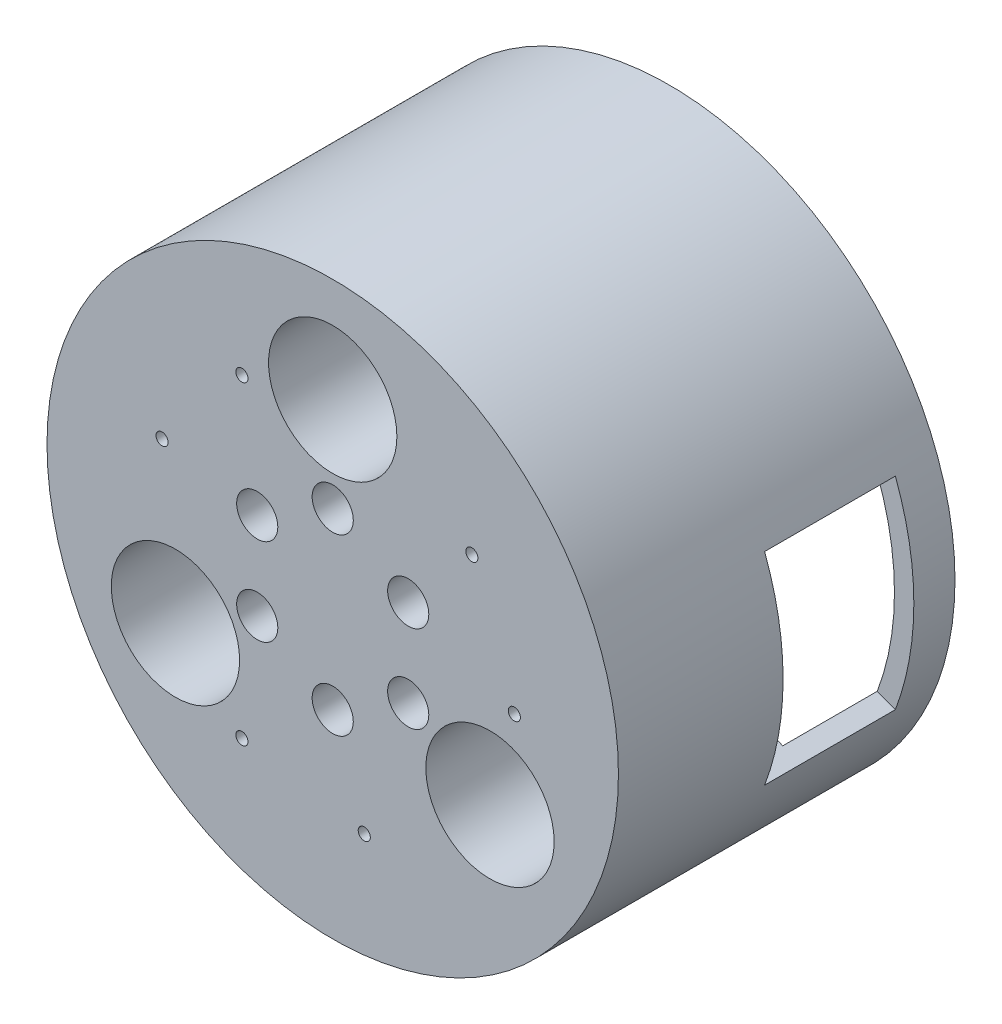
ISO-10303-21;
HEADER;
FILE_DESCRIPTION(('STEP AP214'),'2;1');
FILE_NAME('part.step','',(''),(''),'','','');
FILE_SCHEMA(('AUTOMOTIVE_DESIGN { 1 0 10303 214 1 1 1 1 }'));
ENDSEC;
DATA;
#1=APPLICATION_CONTEXT('core data for automotive mechanical design processes');
#2=APPLICATION_PROTOCOL_DEFINITION('international standard','automotive_design',2000,#1);
#3=PRODUCT_CONTEXT('',#1,'mechanical');
#4=PRODUCT('Part','Part','',(#3));
#5=PRODUCT_RELATED_PRODUCT_CATEGORY('part','',(#4));
#6=PRODUCT_DEFINITION_FORMATION('','',#4);
#7=PRODUCT_DEFINITION_CONTEXT('part definition',#1,'design');
#8=PRODUCT_DEFINITION('design','',#6,#7);
#9=PRODUCT_DEFINITION_SHAPE('','',#8);
#10=(LENGTH_UNIT() NAMED_UNIT(*) SI_UNIT(.MILLI.,.METRE.));
#11=(NAMED_UNIT(*) PLANE_ANGLE_UNIT() SI_UNIT($,.RADIAN.));
#12=(NAMED_UNIT(*) SI_UNIT($,.STERADIAN.) SOLID_ANGLE_UNIT());
#13=UNCERTAINTY_MEASURE_WITH_UNIT(LENGTH_MEASURE(1.E-05),#10,'distance_accuracy_value','');
#14=(GEOMETRIC_REPRESENTATION_CONTEXT(3) GLOBAL_UNCERTAINTY_ASSIGNED_CONTEXT((#13)) GLOBAL_UNIT_ASSIGNED_CONTEXT((#10,
#11,#12)) REPRESENTATION_CONTEXT('',''));
#15=CARTESIAN_POINT('',(0.,0.,0.));
#16=DIRECTION('',(0.,0.,1.));
#17=DIRECTION('',(1.,0.,0.));
#18=AXIS2_PLACEMENT_3D('',#15,#16,#17);
#19=CARTESIAN_POINT('',(0.,0.,28.));
#20=DIRECTION('',(0.,0.,-1.));
#21=DIRECTION('',(-1.,0.,0.));
#22=AXIS2_PLACEMENT_3D('',#19,#20,#21);
#23=CYLINDRICAL_SURFACE('',#22,55.);
#24=CARTESIAN_POINT('',(0.,0.,0.));
#25=DIRECTION('',(0.,0.,1.));
#26=DIRECTION('',(1.,0.,0.));
#27=AXIS2_PLACEMENT_3D('',#24,#25,#26);
#28=CIRCLE('',#27,55.);
#29=CARTESIAN_POINT('',(55.,0.,0.));
#30=VERTEX_POINT('',#29);
#31=EDGE_CURVE('E218',#30,#30,#28,.T.);
#32=ORIENTED_EDGE('',*,*,#31,.F.);
#33=EDGE_LOOP('',(#32));
#34=FACE_BOUND('',#33,.T.);
#35=CARTESIAN_POINT('',(0.,0.,8.5));
#36=DIRECTION('',(0.,0.,1.));
#37=DIRECTION('',(1.,0.,0.));
#38=AXIS2_PLACEMENT_3D('',#35,#36,#37);
#39=CIRCLE('',#38,55.);
#40=CARTESIAN_POINT('',(51.4388666792639,-19.4690265486726,8.5));
#41=VERTEX_POINT('',#40);
#42=CARTESIAN_POINT('',(51.4388666792639,19.4690265486726,8.5));
#43=VERTEX_POINT('',#42);
#44=EDGE_CURVE('E11',#41,#43,#39,.T.);
#45=ORIENTED_EDGE('',*,*,#44,.T.);
#46=DIRECTION('',(0.,0.,-1.));
#47=VECTOR('',#46,1.);
#48=CARTESIAN_POINT('',(51.4388666792639,19.4690265486726,28.));
#49=LINE('',#48,#47);
#50=CARTESIAN_POINT('',(51.4388666792639,19.4690265486726,28.));
#51=VERTEX_POINT('',#50);
#52=EDGE_CURVE('E139',#43,#51,#49,.F.);
#53=ORIENTED_EDGE('',*,*,#52,.T.);
#54=CARTESIAN_POINT('',(0.,0.,28.));
#55=DIRECTION('',(0.,0.,1.));
#56=DIRECTION('',(1.,0.,0.));
#57=AXIS2_PLACEMENT_3D('',#54,#55,#56);
#58=CIRCLE('',#57,55.);
#59=CARTESIAN_POINT('',(51.4388666792639,-19.4690265486726,28.));
#60=VERTEX_POINT('',#59);
#61=EDGE_CURVE('E221',#51,#60,#58,.T.);
#62=ORIENTED_EDGE('',*,*,#61,.T.);
#63=DIRECTION('',(0.,0.,-1.));
#64=VECTOR('',#63,1.);
#65=CARTESIAN_POINT('',(51.4388666792639,-19.4690265486726,28.));
#66=LINE('',#65,#64);
#67=EDGE_CURVE('E134',#60,#41,#66,.T.);
#68=ORIENTED_EDGE('',*,*,#67,.T.);
#69=EDGE_LOOP('',(#45,#53,#62,#68));
#70=FACE_BOUND('',#69,.T.);
#71=ADVANCED_FACE('F41',(#34,#70),#23,.F.);
#72=CARTESIAN_POINT('',(0.,0.,28.));
#73=DIRECTION('',(0.,0.,1.));
#74=DIRECTION('',(1.,0.,0.));
#75=AXIS2_PLACEMENT_3D('',#72,#73,#74);
#76=PLANE('',#75);
#77=DIRECTION('',(0.935252121441161,0.353982300884956,0.));
#78=VECTOR('',#77,1.);
#79=CARTESIAN_POINT('',(0.,0.,28.));
#80=LINE('',#79,#78);
#81=CARTESIAN_POINT('',(50.5036145578227,19.1150442477876,28.));
#82=VERTEX_POINT('',#81);
#83=EDGE_CURVE('E137',#82,#51,#80,.T.);
#84=ORIENTED_EDGE('',*,*,#83,.F.);
#85=CARTESIAN_POINT('',(0.,0.,28.));
#86=DIRECTION('',(0.,0.,1.));
#87=DIRECTION('',(1.,0.,0.));
#88=AXIS2_PLACEMENT_3D('',#85,#86,#87);
#89=CIRCLE('',#88,54.);
#90=CARTESIAN_POINT('',(50.5036145578227,-19.1150442477876,28.));
#91=VERTEX_POINT('',#90);
#92=EDGE_CURVE('E212',#82,#91,#89,.T.);
#93=ORIENTED_EDGE('',*,*,#92,.T.);
#94=DIRECTION('',(-0.935252121441161,0.353982300884956,0.));
#95=VECTOR('',#94,1.);
#96=CARTESIAN_POINT('',(0.,0.,28.));
#97=LINE('',#96,#95);
#98=EDGE_CURVE('E111',#60,#91,#97,.T.);
#99=ORIENTED_EDGE('',*,*,#98,.F.);
#100=ORIENTED_EDGE('',*,*,#61,.F.);
#101=EDGE_LOOP('',(#84,#93,#99,#100));
#102=FACE_BOUND('',#101,.T.);
#103=ADVANCED_FACE('F247',(#102),#76,.F.);
#104=CARTESIAN_POINT('',(0.,0.,40.));
#105=DIRECTION('',(0.,0.,-1.));
#106=DIRECTION('',(-1.,0.,0.));
#107=AXIS2_PLACEMENT_3D('',#104,#105,#106);
#108=CYLINDRICAL_SURFACE('',#107,54.);
#109=CARTESIAN_POINT('',(0.,0.,40.));
#110=DIRECTION('',(0.,0.,1.));
#111=DIRECTION('',(1.,0.,0.));
#112=AXIS2_PLACEMENT_3D('',#109,#110,#111);
#113=CIRCLE('',#112,54.);
#114=CARTESIAN_POINT('',(54.,0.,40.));
#115=VERTEX_POINT('',#114);
#116=EDGE_CURVE('E215',#115,#115,#113,.T.);
#117=ORIENTED_EDGE('',*,*,#116,.T.);
#118=EDGE_LOOP('',(#117));
#119=FACE_BOUND('',#118,.T.);
#120=ORIENTED_EDGE('',*,*,#92,.F.);
#121=DIRECTION('',(0.,0.,-1.));
#122=VECTOR('',#121,1.);
#123=CARTESIAN_POINT('',(50.5036145578227,19.1150442477876,35.5));
#124=LINE('',#123,#122);
#125=CARTESIAN_POINT('',(50.5036145578227,19.1150442477876,35.5));
#126=VERTEX_POINT('',#125);
#127=EDGE_CURVE('E112',#126,#82,#124,.T.);
#128=ORIENTED_EDGE('',*,*,#127,.F.);
#129=CARTESIAN_POINT('',(0.,0.,35.5));
#130=DIRECTION('',(0.,0.,-1.));
#131=DIRECTION('',(-1.,0.,0.));
#132=AXIS2_PLACEMENT_3D('',#129,#130,#131);
#133=CIRCLE('',#132,54.);
#134=CARTESIAN_POINT('',(50.5036145578227,-19.1150442477876,35.5));
#135=VERTEX_POINT('',#134);
#136=EDGE_CURVE('E99',#126,#135,#133,.T.);
#137=ORIENTED_EDGE('',*,*,#136,.T.);
#138=DIRECTION('',(0.,0.,-1.));
#139=VECTOR('',#138,1.);
#140=CARTESIAN_POINT('',(50.5036145578227,-19.1150442477876,35.5));
#141=LINE('',#140,#139);
#142=EDGE_CURVE('E129',#135,#91,#141,.T.);
#143=ORIENTED_EDGE('',*,*,#142,.T.);
#144=EDGE_LOOP('',(#120,#128,#137,#143));
#145=FACE_BOUND('',#144,.T.);
#146=ADVANCED_FACE('F253',(#119,#145),#108,.F.);
#147=CARTESIAN_POINT('',(0.,0.,69.5));
#148=DIRECTION('',(0.,0.,-1.));
#149=DIRECTION('',(-1.,0.,0.));
#150=AXIS2_PLACEMENT_3D('',#147,#148,#149);
#151=CYLINDRICAL_SURFACE('',#150,59.);
#152=DIRECTION('',(0.,0.,-1.));
#153=VECTOR('',#152,1.);
#154=CARTESIAN_POINT('',(55.1798751650285,-20.8849557522124,35.5));
#155=LINE('',#154,#153);
#156=CARTESIAN_POINT('',(55.1798751650285,-20.8849557522124,35.5));
#157=VERTEX_POINT('',#156);
#158=CARTESIAN_POINT('',(55.1798751650285,-20.8849557522124,8.5));
#159=VERTEX_POINT('',#158);
#160=EDGE_CURVE('E56',#157,#159,#155,.T.);
#161=ORIENTED_EDGE('',*,*,#160,.F.);
#162=CARTESIAN_POINT('',(0.,0.,35.5));
#163=DIRECTION('',(0.,0.,1.));
#164=DIRECTION('',(1.,0.,0.));
#165=AXIS2_PLACEMENT_3D('',#162,#163,#164);
#166=CIRCLE('',#165,59.);
#167=CARTESIAN_POINT('',(55.1798751650285,20.8849557522124,35.5));
#168=VERTEX_POINT('',#167);
#169=EDGE_CURVE('E97',#157,#168,#166,.T.);
#170=ORIENTED_EDGE('',*,*,#169,.T.);
#171=DIRECTION('',(0.,0.,-1.));
#172=VECTOR('',#171,1.);
#173=CARTESIAN_POINT('',(55.1798751650285,20.8849557522124,35.5));
#174=LINE('',#173,#172);
#175=CARTESIAN_POINT('',(55.1798751650285,20.8849557522124,8.5));
#176=VERTEX_POINT('',#175);
#177=EDGE_CURVE('E104',#168,#176,#174,.T.);
#178=ORIENTED_EDGE('',*,*,#177,.T.);
#179=CARTESIAN_POINT('',(0.,0.,8.5));
#180=DIRECTION('',(0.,0.,1.));
#181=DIRECTION('',(1.,0.,0.));
#182=AXIS2_PLACEMENT_3D('',#179,#180,#181);
#183=CIRCLE('',#182,59.);
#184=EDGE_CURVE('E124',#159,#176,#183,.T.);
#185=ORIENTED_EDGE('',*,*,#184,.F.);
#186=EDGE_LOOP('',(#161,#170,#178,#185));
#187=FACE_BOUND('',#186,.T.);
#188=CARTESIAN_POINT('',(0.,0.,69.5));
#189=DIRECTION('',(0.,0.,1.));
#190=DIRECTION('',(1.,0.,0.));
#191=AXIS2_PLACEMENT_3D('',#188,#189,#190);
#192=CIRCLE('',#191,59.);
#193=CARTESIAN_POINT('',(59.,0.,69.5));
#194=VERTEX_POINT('',#193);
#195=EDGE_CURVE('E49',#194,#194,#192,.T.);
#196=ORIENTED_EDGE('',*,*,#195,.F.);
#197=EDGE_LOOP('',(#196));
#198=FACE_BOUND('',#197,.T.);
#199=CARTESIAN_POINT('',(0.,0.,0.));
#200=DIRECTION('',(0.,0.,1.));
#201=DIRECTION('',(1.,0.,0.));
#202=AXIS2_PLACEMENT_3D('',#199,#200,#201);
#203=CIRCLE('',#202,59.);
#204=CARTESIAN_POINT('',(59.,0.,0.));
#205=VERTEX_POINT('',#204);
#206=EDGE_CURVE('E224',#205,#205,#203,.T.);
#207=ORIENTED_EDGE('',*,*,#206,.T.);
#208=EDGE_LOOP('',(#207));
#209=FACE_BOUND('',#208,.T.);
#210=ADVANCED_FACE('F43',(#187,#198,#209),#151,.T.);
#211=CARTESIAN_POINT('',(0.,0.,69.5));
#212=DIRECTION('',(0.,0.,1.));
#213=DIRECTION('',(1.,0.,0.));
#214=AXIS2_PLACEMENT_3D('',#211,#212,#213);
#215=PLANE('',#214);
#216=CARTESIAN_POINT('',(-35.2384732794716,12.8257553747126,69.5));
#217=DIRECTION('',(0.,0.,1.));
#218=DIRECTION('',(1.,0.,0.));
#219=AXIS2_PLACEMENT_3D('',#216,#217,#218);
#220=CIRCLE('',#219,1.25);
#221=CARTESIAN_POINT('',(-33.9884732794716,12.8257553747126,69.5));
#222=VERTEX_POINT('',#221);
#223=EDGE_CURVE('E426',#222,#222,#220,.T.);
#224=ORIENTED_EDGE('',*,*,#223,.F.);
#225=EDGE_LOOP('',(#224));
#226=FACE_BOUND('',#225,.T.);
#227=CARTESIAN_POINT('',(-18.75,-32.4759526419164,69.5));
#228=DIRECTION('',(0.,0.,1.));
#229=DIRECTION('',(1.,0.,0.));
#230=AXIS2_PLACEMENT_3D('',#227,#228,#229);
#231=CIRCLE('',#230,1.25);
#232=CARTESIAN_POINT('',(-17.5,-32.4759526419164,69.5));
#233=VERTEX_POINT('',#232);
#234=EDGE_CURVE('E432',#233,#233,#231,.T.);
#235=ORIENTED_EDGE('',*,*,#234,.F.);
#236=EDGE_LOOP('',(#235));
#237=FACE_BOUND('',#236,.T.);
#238=CARTESIAN_POINT('',(6.51180666250987,-36.9302907379578,69.5));
#239=DIRECTION('',(0.,0.,1.));
#240=DIRECTION('',(1.,0.,0.));
#241=AXIS2_PLACEMENT_3D('',#238,#239,#240);
#242=CIRCLE('',#241,1.25);
#243=CARTESIAN_POINT('',(7.76180666250987,-36.9302907379578,69.5));
#244=VERTEX_POINT('',#243);
#245=EDGE_CURVE('E416',#244,#244,#242,.T.);
#246=ORIENTED_EDGE('',*,*,#245,.F.);
#247=EDGE_LOOP('',(#246));
#248=FACE_BOUND('',#247,.T.);
#249=CARTESIAN_POINT('',(37.5,0.,69.5));
#250=DIRECTION('',(0.,0.,1.));
#251=DIRECTION('',(1.,0.,0.));
#252=AXIS2_PLACEMENT_3D('',#249,#250,#251);
#253=CIRCLE('',#252,1.25);
#254=CARTESIAN_POINT('',(38.75,0.,69.5));
#255=VERTEX_POINT('',#254);
#256=EDGE_CURVE('E411',#255,#255,#253,.T.);
#257=ORIENTED_EDGE('',*,*,#256,.F.);
#258=EDGE_LOOP('',(#257));
#259=FACE_BOUND('',#258,.T.);
#260=CARTESIAN_POINT('',(28.7266666169617,24.1045353632452,69.5));
#261=DIRECTION('',(0.,0.,1.));
#262=DIRECTION('',(1.,0.,0.));
#263=AXIS2_PLACEMENT_3D('',#260,#261,#262);
#264=CIRCLE('',#263,1.25);
#265=CARTESIAN_POINT('',(29.9766666169617,24.1045353632452,69.5));
#266=VERTEX_POINT('',#265);
#267=EDGE_CURVE('E418',#266,#266,#264,.T.);
#268=ORIENTED_EDGE('',*,*,#267,.F.);
#269=EDGE_LOOP('',(#268));
#270=FACE_BOUND('',#269,.T.);
#271=CARTESIAN_POINT('',(-18.75,32.4759526419165,69.5));
#272=DIRECTION('',(0.,0.,1.));
#273=DIRECTION('',(1.,0.,0.));
#274=AXIS2_PLACEMENT_3D('',#271,#272,#273);
#275=CIRCLE('',#274,1.25);
#276=CARTESIAN_POINT('',(-17.5,32.4759526419165,69.5));
#277=VERTEX_POINT('',#276);
#278=EDGE_CURVE('E119',#277,#277,#275,.T.);
#279=ORIENTED_EDGE('',*,*,#278,.F.);
#280=EDGE_LOOP('',(#279));
#281=FACE_BOUND('',#280,.T.);
#282=CARTESIAN_POINT('',(0.,37.5,69.5));
#283=DIRECTION('',(0.,0.,1.));
#284=DIRECTION('',(1.,0.,0.));
#285=AXIS2_PLACEMENT_3D('',#282,#283,#284);
#286=CIRCLE('',#285,13.25);
#287=CARTESIAN_POINT('',(13.25,37.5,69.5));
#288=VERTEX_POINT('',#287);
#289=EDGE_CURVE('E165',#288,#288,#286,.T.);
#290=ORIENTED_EDGE('',*,*,#289,.F.);
#291=EDGE_LOOP('',(#290));
#292=FACE_BOUND('',#291,.T.);
#293=CARTESIAN_POINT('',(-32.4759526419165,-18.75,69.5));
#294=DIRECTION('',(0.,0.,1.));
#295=DIRECTION('',(1.,0.,0.));
#296=AXIS2_PLACEMENT_3D('',#293,#294,#295);
#297=CIRCLE('',#296,13.25);
#298=CARTESIAN_POINT('',(-19.2259526419165,-18.75,69.5));
#299=VERTEX_POINT('',#298);
#300=EDGE_CURVE('E168',#299,#299,#297,.T.);
#301=ORIENTED_EDGE('',*,*,#300,.F.);
#302=EDGE_LOOP('',(#301));
#303=FACE_BOUND('',#302,.T.);
#304=CARTESIAN_POINT('',(32.4759526419164,-18.75,69.5));
#305=DIRECTION('',(0.,0.,1.));
#306=DIRECTION('',(1.,0.,0.));
#307=AXIS2_PLACEMENT_3D('',#304,#305,#306);
#308=CIRCLE('',#307,13.25);
#309=CARTESIAN_POINT('',(45.7259526419164,-18.75,69.5));
#310=VERTEX_POINT('',#309);
#311=EDGE_CURVE('E174',#310,#310,#308,.T.);
#312=ORIENTED_EDGE('',*,*,#311,.F.);
#313=EDGE_LOOP('',(#312));
#314=FACE_BOUND('',#313,.T.);
#315=CARTESIAN_POINT('',(15.5884572681199,-8.99999999999999,69.5));
#316=DIRECTION('',(0.,0.,1.));
#317=DIRECTION('',(1.,0.,0.));
#318=AXIS2_PLACEMENT_3D('',#315,#316,#317);
#319=CIRCLE('',#318,4.25);
#320=CARTESIAN_POINT('',(19.8384572681199,-8.99999999999999,69.5));
#321=VERTEX_POINT('',#320);
#322=EDGE_CURVE('E204',#321,#321,#319,.T.);
#323=ORIENTED_EDGE('',*,*,#322,.F.);
#324=EDGE_LOOP('',(#323));
#325=FACE_BOUND('',#324,.T.);
#326=CARTESIAN_POINT('',(0.,-18.,69.5));
#327=DIRECTION('',(0.,0.,1.));
#328=DIRECTION('',(1.,0.,0.));
#329=AXIS2_PLACEMENT_3D('',#326,#327,#328);
#330=CIRCLE('',#329,4.25);
#331=CARTESIAN_POINT('',(4.25,-18.,69.5));
#332=VERTEX_POINT('',#331);
#333=EDGE_CURVE('E198',#332,#332,#330,.T.);
#334=ORIENTED_EDGE('',*,*,#333,.F.);
#335=EDGE_LOOP('',(#334));
#336=FACE_BOUND('',#335,.T.);
#337=CARTESIAN_POINT('',(-15.5884572681199,-8.99999999999999,69.5));
#338=DIRECTION('',(0.,0.,1.));
#339=DIRECTION('',(1.,0.,0.));
#340=AXIS2_PLACEMENT_3D('',#337,#338,#339);
#341=CIRCLE('',#340,4.25);
#342=CARTESIAN_POINT('',(-11.3384572681199,-8.99999999999999,69.5));
#343=VERTEX_POINT('',#342);
#344=EDGE_CURVE('E192',#343,#343,#341,.T.);
#345=ORIENTED_EDGE('',*,*,#344,.F.);
#346=EDGE_LOOP('',(#345));
#347=FACE_BOUND('',#346,.T.);
#348=CARTESIAN_POINT('',(-15.5884572681199,9.00000000000001,69.5));
#349=DIRECTION('',(0.,0.,1.));
#350=DIRECTION('',(1.,0.,0.));
#351=AXIS2_PLACEMENT_3D('',#348,#349,#350);
#352=CIRCLE('',#351,4.25);
#353=CARTESIAN_POINT('',(-11.3384572681199,9.00000000000001,69.5));
#354=VERTEX_POINT('',#353);
#355=EDGE_CURVE('E186',#354,#354,#352,.T.);
#356=ORIENTED_EDGE('',*,*,#355,.F.);
#357=EDGE_LOOP('',(#356));
#358=FACE_BOUND('',#357,.T.);
#359=CARTESIAN_POINT('',(0.,18.,69.5));
#360=DIRECTION('',(0.,0.,1.));
#361=DIRECTION('',(1.,0.,0.));
#362=AXIS2_PLACEMENT_3D('',#359,#360,#361);
#363=CIRCLE('',#362,4.25);
#364=CARTESIAN_POINT('',(4.25,18.,69.5));
#365=VERTEX_POINT('',#364);
#366=EDGE_CURVE('E179',#365,#365,#363,.T.);
#367=ORIENTED_EDGE('',*,*,#366,.F.);
#368=EDGE_LOOP('',(#367));
#369=FACE_BOUND('',#368,.T.);
#370=CARTESIAN_POINT('',(15.5884572681199,9.,69.5));
#371=DIRECTION('',(0.,0.,1.));
#372=DIRECTION('',(1.,0.,0.));
#373=AXIS2_PLACEMENT_3D('',#370,#371,#372);
#374=CIRCLE('',#373,4.25);
#375=CARTESIAN_POINT('',(19.8384572681199,9.,69.5));
#376=VERTEX_POINT('',#375);
#377=EDGE_CURVE('E182',#376,#376,#374,.T.);
#378=ORIENTED_EDGE('',*,*,#377,.F.);
#379=EDGE_LOOP('',(#378));
#380=FACE_BOUND('',#379,.T.);
#381=ORIENTED_EDGE('',*,*,#195,.T.);
#382=EDGE_LOOP('',(#381));
#383=FACE_BOUND('',#382,.T.);
#384=ADVANCED_FACE('F235',(#226,#237,#248,#259,#270,#281,#292,#303,#314,#325,#336,#347,#358,
#369,#380,#383),#215,.T.);
#385=CARTESIAN_POINT('',(0.,0.,0.));
#386=DIRECTION('',(0.,0.,1.));
#387=DIRECTION('',(1.,0.,0.));
#388=AXIS2_PLACEMENT_3D('',#385,#386,#387);
#389=PLANE('',#388);
#390=ORIENTED_EDGE('',*,*,#31,.T.);
#391=EDGE_LOOP('',(#390));
#392=FACE_BOUND('',#391,.T.);
#393=ORIENTED_EDGE('',*,*,#206,.F.);
#394=EDGE_LOOP('',(#393));
#395=FACE_BOUND('',#394,.T.);
#396=ADVANCED_FACE('F232',(#392,#395),#389,.F.);
#397=CARTESIAN_POINT('',(0.,0.,40.));
#398=DIRECTION('',(0.,0.,1.));
#399=DIRECTION('',(1.,0.,0.));
#400=AXIS2_PLACEMENT_3D('',#397,#398,#399);
#401=PLANE('',#400);
#402=CARTESIAN_POINT('',(0.,37.5,40.));
#403=DIRECTION('',(0.,0.,1.));
#404=DIRECTION('',(1.,0.,0.));
#405=AXIS2_PLACEMENT_3D('',#402,#403,#404);
#406=CIRCLE('',#405,9.);
#407=CARTESIAN_POINT('',(9.,37.5,40.));
#408=VERTEX_POINT('',#407);
#409=EDGE_CURVE('E143',#408,#408,#406,.T.);
#410=ORIENTED_EDGE('',*,*,#409,.T.);
#411=EDGE_LOOP('',(#410));
#412=FACE_BOUND('',#411,.T.);
#413=CARTESIAN_POINT('',(-32.4759526419165,-18.75,40.));
#414=DIRECTION('',(0.,0.,1.));
#415=DIRECTION('',(1.,0.,0.));
#416=AXIS2_PLACEMENT_3D('',#413,#414,#415);
#417=CIRCLE('',#416,9.);
#418=CARTESIAN_POINT('',(-23.4759526419165,-18.75,40.));
#419=VERTEX_POINT('',#418);
#420=EDGE_CURVE('E153',#419,#419,#417,.T.);
#421=ORIENTED_EDGE('',*,*,#420,.T.);
#422=EDGE_LOOP('',(#421));
#423=FACE_BOUND('',#422,.T.);
#424=CARTESIAN_POINT('',(32.4759526419164,-18.75,40.));
#425=DIRECTION('',(0.,0.,1.));
#426=DIRECTION('',(1.,0.,0.));
#427=AXIS2_PLACEMENT_3D('',#424,#425,#426);
#428=CIRCLE('',#427,9.);
#429=CARTESIAN_POINT('',(41.4759526419164,-18.75,40.));
#430=VERTEX_POINT('',#429);
#431=EDGE_CURVE('E142',#430,#430,#428,.T.);
#432=ORIENTED_EDGE('',*,*,#431,.T.);
#433=EDGE_LOOP('',(#432));
#434=FACE_BOUND('',#433,.T.);
#435=ORIENTED_EDGE('',*,*,#116,.F.);
#436=EDGE_LOOP('',(#435));
#437=FACE_BOUND('',#436,.T.);
#438=ADVANCED_FACE('F234',(#412,#423,#434,#437),#401,.F.);
#439=CARTESIAN_POINT('',(15.5884572681199,9.,45.5));
#440=DIRECTION('',(0.,0.,1.));
#441=DIRECTION('',(1.,0.,0.));
#442=AXIS2_PLACEMENT_3D('',#439,#440,#441);
#443=CYLINDRICAL_SURFACE('',#442,4.25);
#444=CARTESIAN_POINT('',(15.5884572681199,9.,45.5));
#445=DIRECTION('',(0.,0.,1.));
#446=DIRECTION('',(1.,0.,0.));
#447=AXIS2_PLACEMENT_3D('',#444,#445,#446);
#448=CIRCLE('',#447,4.25);
#449=CARTESIAN_POINT('',(19.8384572681199,9.,45.5));
#450=VERTEX_POINT('',#449);
#451=EDGE_CURVE('E209',#450,#450,#448,.T.);
#452=ORIENTED_EDGE('',*,*,#451,.F.);
#453=EDGE_LOOP('',(#452));
#454=FACE_BOUND('',#453,.T.);
#455=ORIENTED_EDGE('',*,*,#377,.T.);
#456=EDGE_LOOP('',(#455));
#457=FACE_BOUND('',#456,.T.);
#458=ADVANCED_FACE('F241',(#454,#457),#443,.F.);
#459=CARTESIAN_POINT('',(15.5884572681199,9.,45.5));
#460=DIRECTION('',(0.,0.,1.));
#461=DIRECTION('',(1.,0.,0.));
#462=AXIS2_PLACEMENT_3D('',#459,#460,#461);
#463=PLANE('',#462);
#464=ORIENTED_EDGE('',*,*,#451,.T.);
#465=EDGE_LOOP('',(#464));
#466=FACE_BOUND('',#465,.T.);
#467=ADVANCED_FACE('F264',(#466),#463,.T.);
#468=CARTESIAN_POINT('',(0.,18.,45.5));
#469=DIRECTION('',(0.,0.,1.));
#470=DIRECTION('',(1.,0.,0.));
#471=AXIS2_PLACEMENT_3D('',#468,#469,#470);
#472=CYLINDRICAL_SURFACE('',#471,4.25);
#473=CARTESIAN_POINT('',(0.,18.,45.5));
#474=DIRECTION('',(0.,0.,1.));
#475=DIRECTION('',(1.,0.,0.));
#476=AXIS2_PLACEMENT_3D('',#473,#474,#475);
#477=CIRCLE('',#476,4.25);
#478=CARTESIAN_POINT('',(4.25,18.,45.5));
#479=VERTEX_POINT('',#478);
#480=EDGE_CURVE('E183',#479,#479,#477,.T.);
#481=ORIENTED_EDGE('',*,*,#480,.F.);
#482=EDGE_LOOP('',(#481));
#483=FACE_BOUND('',#482,.T.);
#484=ORIENTED_EDGE('',*,*,#366,.T.);
#485=EDGE_LOOP('',(#484));
#486=FACE_BOUND('',#485,.T.);
#487=ADVANCED_FACE('F268',(#483,#486),#472,.F.);
#488=CARTESIAN_POINT('',(0.,18.,45.5));
#489=DIRECTION('',(0.,0.,1.));
#490=DIRECTION('',(1.,0.,0.));
#491=AXIS2_PLACEMENT_3D('',#488,#489,#490);
#492=PLANE('',#491);
#493=ORIENTED_EDGE('',*,*,#480,.T.);
#494=EDGE_LOOP('',(#493));
#495=FACE_BOUND('',#494,.T.);
#496=ADVANCED_FACE('F302',(#495),#492,.T.);
#497=CARTESIAN_POINT('',(-15.5884572681199,9.00000000000001,45.5));
#498=DIRECTION('',(0.,0.,1.));
#499=DIRECTION('',(1.,0.,0.));
#500=AXIS2_PLACEMENT_3D('',#497,#498,#499);
#501=CYLINDRICAL_SURFACE('',#500,4.25);
#502=CARTESIAN_POINT('',(-15.5884572681199,9.00000000000001,45.5));
#503=DIRECTION('',(0.,0.,1.));
#504=DIRECTION('',(1.,0.,0.));
#505=AXIS2_PLACEMENT_3D('',#502,#503,#504);
#506=CIRCLE('',#505,4.25);
#507=CARTESIAN_POINT('',(-11.3384572681199,9.00000000000001,45.5));
#508=VERTEX_POINT('',#507);
#509=EDGE_CURVE('E189',#508,#508,#506,.T.);
#510=ORIENTED_EDGE('',*,*,#509,.F.);
#511=EDGE_LOOP('',(#510));
#512=FACE_BOUND('',#511,.T.);
#513=ORIENTED_EDGE('',*,*,#355,.T.);
#514=EDGE_LOOP('',(#513));
#515=FACE_BOUND('',#514,.T.);
#516=ADVANCED_FACE('F298',(#512,#515),#501,.F.);
#517=CARTESIAN_POINT('',(-15.5884572681199,9.00000000000001,45.5));
#518=DIRECTION('',(0.,0.,1.));
#519=DIRECTION('',(1.,0.,0.));
#520=AXIS2_PLACEMENT_3D('',#517,#518,#519);
#521=PLANE('',#520);
#522=ORIENTED_EDGE('',*,*,#509,.T.);
#523=EDGE_LOOP('',(#522));
#524=FACE_BOUND('',#523,.T.);
#525=ADVANCED_FACE('F294',(#524),#521,.T.);
#526=CARTESIAN_POINT('',(-15.5884572681199,-8.99999999999999,45.5));
#527=DIRECTION('',(0.,0.,1.));
#528=DIRECTION('',(1.,0.,0.));
#529=AXIS2_PLACEMENT_3D('',#526,#527,#528);
#530=CYLINDRICAL_SURFACE('',#529,4.25);
#531=CARTESIAN_POINT('',(-15.5884572681199,-8.99999999999999,45.5));
#532=DIRECTION('',(0.,0.,1.));
#533=DIRECTION('',(1.,0.,0.));
#534=AXIS2_PLACEMENT_3D('',#531,#532,#533);
#535=CIRCLE('',#534,4.25);
#536=CARTESIAN_POINT('',(-11.3384572681199,-8.99999999999999,45.5));
#537=VERTEX_POINT('',#536);
#538=EDGE_CURVE('E195',#537,#537,#535,.T.);
#539=ORIENTED_EDGE('',*,*,#538,.F.);
#540=EDGE_LOOP('',(#539));
#541=FACE_BOUND('',#540,.T.);
#542=ORIENTED_EDGE('',*,*,#344,.T.);
#543=EDGE_LOOP('',(#542));
#544=FACE_BOUND('',#543,.T.);
#545=ADVANCED_FACE('F290',(#541,#544),#530,.F.);
#546=CARTESIAN_POINT('',(-15.5884572681199,-8.99999999999999,45.5));
#547=DIRECTION('',(0.,0.,1.));
#548=DIRECTION('',(1.,0.,0.));
#549=AXIS2_PLACEMENT_3D('',#546,#547,#548);
#550=PLANE('',#549);
#551=ORIENTED_EDGE('',*,*,#538,.T.);
#552=EDGE_LOOP('',(#551));
#553=FACE_BOUND('',#552,.T.);
#554=ADVANCED_FACE('F286',(#553),#550,.T.);
#555=CARTESIAN_POINT('',(0.,-18.,45.5));
#556=DIRECTION('',(0.,0.,1.));
#557=DIRECTION('',(1.,0.,0.));
#558=AXIS2_PLACEMENT_3D('',#555,#556,#557);
#559=CYLINDRICAL_SURFACE('',#558,4.25);
#560=CARTESIAN_POINT('',(0.,-18.,45.5));
#561=DIRECTION('',(0.,0.,1.));
#562=DIRECTION('',(1.,0.,0.));
#563=AXIS2_PLACEMENT_3D('',#560,#561,#562);
#564=CIRCLE('',#563,4.25);
#565=CARTESIAN_POINT('',(4.25,-18.,45.5));
#566=VERTEX_POINT('',#565);
#567=EDGE_CURVE('E201',#566,#566,#564,.T.);
#568=ORIENTED_EDGE('',*,*,#567,.F.);
#569=EDGE_LOOP('',(#568));
#570=FACE_BOUND('',#569,.T.);
#571=ORIENTED_EDGE('',*,*,#333,.T.);
#572=EDGE_LOOP('',(#571));
#573=FACE_BOUND('',#572,.T.);
#574=ADVANCED_FACE('F282',(#570,#573),#559,.F.);
#575=CARTESIAN_POINT('',(0.,-18.,45.5));
#576=DIRECTION('',(0.,0.,1.));
#577=DIRECTION('',(1.,0.,0.));
#578=AXIS2_PLACEMENT_3D('',#575,#576,#577);
#579=PLANE('',#578);
#580=ORIENTED_EDGE('',*,*,#567,.T.);
#581=EDGE_LOOP('',(#580));
#582=FACE_BOUND('',#581,.T.);
#583=ADVANCED_FACE('F278',(#582),#579,.T.);
#584=CARTESIAN_POINT('',(15.5884572681199,-8.99999999999999,45.5));
#585=DIRECTION('',(0.,0.,1.));
#586=DIRECTION('',(1.,0.,0.));
#587=AXIS2_PLACEMENT_3D('',#584,#585,#586);
#588=CYLINDRICAL_SURFACE('',#587,4.25);
#589=CARTESIAN_POINT('',(15.5884572681199,-8.99999999999999,45.5));
#590=DIRECTION('',(0.,0.,1.));
#591=DIRECTION('',(1.,0.,0.));
#592=AXIS2_PLACEMENT_3D('',#589,#590,#591);
#593=CIRCLE('',#592,4.25);
#594=CARTESIAN_POINT('',(19.8384572681199,-8.99999999999999,45.5));
#595=VERTEX_POINT('',#594);
#596=EDGE_CURVE('E164',#595,#595,#593,.T.);
#597=ORIENTED_EDGE('',*,*,#596,.F.);
#598=EDGE_LOOP('',(#597));
#599=FACE_BOUND('',#598,.T.);
#600=ORIENTED_EDGE('',*,*,#322,.T.);
#601=EDGE_LOOP('',(#600));
#602=FACE_BOUND('',#601,.T.);
#603=ADVANCED_FACE('F274',(#599,#602),#588,.F.);
#604=CARTESIAN_POINT('',(15.5884572681199,-8.99999999999999,45.5));
#605=DIRECTION('',(0.,0.,1.));
#606=DIRECTION('',(1.,0.,0.));
#607=AXIS2_PLACEMENT_3D('',#604,#605,#606);
#608=PLANE('',#607);
#609=ORIENTED_EDGE('',*,*,#596,.T.);
#610=EDGE_LOOP('',(#609));
#611=FACE_BOUND('',#610,.T.);
#612=ADVANCED_FACE('F270',(#611),#608,.T.);
#613=CARTESIAN_POINT('',(32.4759526419164,-18.75,50.));
#614=DIRECTION('',(0.,0.,1.));
#615=DIRECTION('',(1.,0.,0.));
#616=AXIS2_PLACEMENT_3D('',#613,#614,#615);
#617=CYLINDRICAL_SURFACE('',#616,13.25);
#618=CARTESIAN_POINT('',(32.4759526419164,-18.75,50.));
#619=DIRECTION('',(0.,0.,1.));
#620=DIRECTION('',(1.,0.,0.));
#621=AXIS2_PLACEMENT_3D('',#618,#619,#620);
#622=CIRCLE('',#621,13.25);
#623=CARTESIAN_POINT('',(45.7259526419164,-18.75,50.));
#624=VERTEX_POINT('',#623);
#625=EDGE_CURVE('E146',#624,#624,#622,.T.);
#626=ORIENTED_EDGE('',*,*,#625,.F.);
#627=EDGE_LOOP('',(#626));
#628=FACE_BOUND('',#627,.T.);
#629=ORIENTED_EDGE('',*,*,#311,.T.);
#630=EDGE_LOOP('',(#629));
#631=FACE_BOUND('',#630,.T.);
#632=ADVANCED_FACE('F273',(#628,#631),#617,.F.);
#633=CARTESIAN_POINT('',(32.4759526419164,-18.75,50.));
#634=DIRECTION('',(0.,0.,1.));
#635=DIRECTION('',(1.,0.,0.));
#636=AXIS2_PLACEMENT_3D('',#633,#634,#635);
#637=PLANE('',#636);
#638=CARTESIAN_POINT('',(32.4759526419164,-18.75,50.));
#639=DIRECTION('',(0.,0.,1.));
#640=DIRECTION('',(1.,0.,0.));
#641=AXIS2_PLACEMENT_3D('',#638,#639,#640);
#642=CIRCLE('',#641,9.);
#643=CARTESIAN_POINT('',(41.4759526419164,-18.75,50.));
#644=VERTEX_POINT('',#643);
#645=EDGE_CURVE('E156',#644,#644,#642,.T.);
#646=ORIENTED_EDGE('',*,*,#645,.F.);
#647=EDGE_LOOP('',(#646));
#648=FACE_BOUND('',#647,.T.);
#649=ORIENTED_EDGE('',*,*,#625,.T.);
#650=EDGE_LOOP('',(#649));
#651=FACE_BOUND('',#650,.T.);
#652=ADVANCED_FACE('F310',(#648,#651),#637,.T.);
#653=CARTESIAN_POINT('',(-32.4759526419165,-18.75,50.));
#654=DIRECTION('',(0.,0.,1.));
#655=DIRECTION('',(1.,0.,0.));
#656=AXIS2_PLACEMENT_3D('',#653,#654,#655);
#657=CYLINDRICAL_SURFACE('',#656,13.25);
#658=CARTESIAN_POINT('',(-32.4759526419165,-18.75,50.));
#659=DIRECTION('',(0.,0.,1.));
#660=DIRECTION('',(1.,0.,0.));
#661=AXIS2_PLACEMENT_3D('',#658,#659,#660);
#662=CIRCLE('',#661,13.25);
#663=CARTESIAN_POINT('',(-19.2259526419165,-18.75,50.));
#664=VERTEX_POINT('',#663);
#665=EDGE_CURVE('E171',#664,#664,#662,.T.);
#666=ORIENTED_EDGE('',*,*,#665,.F.);
#667=EDGE_LOOP('',(#666));
#668=FACE_BOUND('',#667,.T.);
#669=ORIENTED_EDGE('',*,*,#300,.T.);
#670=EDGE_LOOP('',(#669));
#671=FACE_BOUND('',#670,.T.);
#672=ADVANCED_FACE('F313',(#668,#671),#657,.F.);
#673=CARTESIAN_POINT('',(-32.4759526419165,-18.75,50.));
#674=DIRECTION('',(0.,0.,1.));
#675=DIRECTION('',(1.,0.,0.));
#676=AXIS2_PLACEMENT_3D('',#673,#674,#675);
#677=PLANE('',#676);
#678=CARTESIAN_POINT('',(-32.4759526419165,-18.75,50.));
#679=DIRECTION('',(0.,0.,1.));
#680=DIRECTION('',(1.,0.,0.));
#681=AXIS2_PLACEMENT_3D('',#678,#679,#680);
#682=CIRCLE('',#681,9.);
#683=CARTESIAN_POINT('',(-23.4759526419165,-18.75,50.));
#684=VERTEX_POINT('',#683);
#685=EDGE_CURVE('E150',#684,#684,#682,.T.);
#686=ORIENTED_EDGE('',*,*,#685,.F.);
#687=EDGE_LOOP('',(#686));
#688=FACE_BOUND('',#687,.T.);
#689=ORIENTED_EDGE('',*,*,#665,.T.);
#690=EDGE_LOOP('',(#689));
#691=FACE_BOUND('',#690,.T.);
#692=ADVANCED_FACE('F318',(#688,#691),#677,.T.);
#693=CARTESIAN_POINT('',(0.,37.5,50.));
#694=DIRECTION('',(0.,0.,1.));
#695=DIRECTION('',(1.,0.,0.));
#696=AXIS2_PLACEMENT_3D('',#693,#694,#695);
#697=CYLINDRICAL_SURFACE('',#696,13.25);
#698=CARTESIAN_POINT('',(0.,37.5,50.));
#699=DIRECTION('',(0.,0.,1.));
#700=DIRECTION('',(1.,0.,0.));
#701=AXIS2_PLACEMENT_3D('',#698,#699,#700);
#702=CIRCLE('',#701,13.25);
#703=CARTESIAN_POINT('',(13.25,37.5,50.));
#704=VERTEX_POINT('',#703);
#705=EDGE_CURVE('E161',#704,#704,#702,.T.);
#706=ORIENTED_EDGE('',*,*,#705,.F.);
#707=EDGE_LOOP('',(#706));
#708=FACE_BOUND('',#707,.T.);
#709=ORIENTED_EDGE('',*,*,#289,.T.);
#710=EDGE_LOOP('',(#709));
#711=FACE_BOUND('',#710,.T.);
#712=ADVANCED_FACE('F321',(#708,#711),#697,.F.);
#713=CARTESIAN_POINT('',(0.,37.5,50.));
#714=DIRECTION('',(0.,0.,1.));
#715=DIRECTION('',(1.,0.,0.));
#716=AXIS2_PLACEMENT_3D('',#713,#714,#715);
#717=PLANE('',#716);
#718=CARTESIAN_POINT('',(0.,37.5,50.));
#719=DIRECTION('',(0.,0.,1.));
#720=DIRECTION('',(1.,0.,0.));
#721=AXIS2_PLACEMENT_3D('',#718,#719,#720);
#722=CIRCLE('',#721,9.);
#723=CARTESIAN_POINT('',(9.,37.5,50.));
#724=VERTEX_POINT('',#723);
#725=EDGE_CURVE('E147',#724,#724,#722,.T.);
#726=ORIENTED_EDGE('',*,*,#725,.F.);
#727=EDGE_LOOP('',(#726));
#728=FACE_BOUND('',#727,.T.);
#729=ORIENTED_EDGE('',*,*,#705,.T.);
#730=EDGE_LOOP('',(#729));
#731=FACE_BOUND('',#730,.T.);
#732=ADVANCED_FACE('F328',(#728,#731),#717,.T.);
#733=CARTESIAN_POINT('',(32.4759526419164,-18.75,40.));
#734=DIRECTION('',(0.,0.,1.));
#735=DIRECTION('',(1.,0.,0.));
#736=AXIS2_PLACEMENT_3D('',#733,#734,#735);
#737=CYLINDRICAL_SURFACE('',#736,9.);
#738=ORIENTED_EDGE('',*,*,#431,.F.);
#739=EDGE_LOOP('',(#738));
#740=FACE_BOUND('',#739,.T.);
#741=ORIENTED_EDGE('',*,*,#645,.T.);
#742=EDGE_LOOP('',(#741));
#743=FACE_BOUND('',#742,.T.);
#744=ADVANCED_FACE('F332',(#740,#743),#737,.F.);
#745=CARTESIAN_POINT('',(-32.4759526419165,-18.75,40.));
#746=DIRECTION('',(0.,0.,1.));
#747=DIRECTION('',(1.,0.,0.));
#748=AXIS2_PLACEMENT_3D('',#745,#746,#747);
#749=CYLINDRICAL_SURFACE('',#748,9.);
#750=ORIENTED_EDGE('',*,*,#420,.F.);
#751=EDGE_LOOP('',(#750));
#752=FACE_BOUND('',#751,.T.);
#753=ORIENTED_EDGE('',*,*,#685,.T.);
#754=EDGE_LOOP('',(#753));
#755=FACE_BOUND('',#754,.T.);
#756=ADVANCED_FACE('F336',(#752,#755),#749,.F.);
#757=CARTESIAN_POINT('',(0.,37.5,40.));
#758=DIRECTION('',(0.,0.,1.));
#759=DIRECTION('',(1.,0.,0.));
#760=AXIS2_PLACEMENT_3D('',#757,#758,#759);
#761=CYLINDRICAL_SURFACE('',#760,9.);
#762=ORIENTED_EDGE('',*,*,#409,.F.);
#763=EDGE_LOOP('',(#762));
#764=FACE_BOUND('',#763,.T.);
#765=ORIENTED_EDGE('',*,*,#725,.T.);
#766=EDGE_LOOP('',(#765));
#767=FACE_BOUND('',#766,.T.);
#768=ADVANCED_FACE('F340',(#764,#767),#761,.F.);
#769=CARTESIAN_POINT('',(55.1798751650285,20.8849557522124,35.5));
#770=DIRECTION('',(0.353982300884956,-0.935252121441161,0.));
#771=DIRECTION('',(0.935252121441161,0.353982300884956,0.));
#772=AXIS2_PLACEMENT_3D('',#769,#770,#771);
#773=PLANE('',#772);
#774=DIRECTION('',(-0.935252121441161,-0.353982300884956,0.));
#775=VECTOR('',#774,1.);
#776=CARTESIAN_POINT('',(55.1798751650285,20.8849557522124,8.5));
#777=LINE('',#776,#775);
#778=EDGE_CURVE('E107',#176,#43,#777,.T.);
#779=ORIENTED_EDGE('',*,*,#778,.F.);
#780=ORIENTED_EDGE('',*,*,#177,.F.);
#781=DIRECTION('',(-0.935252121441161,-0.353982300884956,0.));
#782=VECTOR('',#781,1.);
#783=CARTESIAN_POINT('',(55.1798751650285,20.8849557522124,35.5));
#784=LINE('',#783,#782);
#785=EDGE_CURVE('E93',#168,#126,#784,.T.);
#786=ORIENTED_EDGE('',*,*,#785,.T.);
#787=ORIENTED_EDGE('',*,*,#127,.T.);
#788=ORIENTED_EDGE('',*,*,#83,.T.);
#789=ORIENTED_EDGE('',*,*,#52,.F.);
#790=EDGE_LOOP('',(#779,#780,#786,#787,#788,#789));
#791=FACE_BOUND('',#790,.T.);
#792=ADVANCED_FACE('F105',(#791),#773,.T.);
#793=CARTESIAN_POINT('',(50.5036145578227,-19.1150442477876,35.5));
#794=DIRECTION('',(0.353982300884956,0.935252121441161,0.));
#795=DIRECTION('',(-0.935252121441161,0.353982300884956,0.));
#796=AXIS2_PLACEMENT_3D('',#793,#794,#795);
#797=PLANE('',#796);
#798=ORIENTED_EDGE('',*,*,#98,.T.);
#799=ORIENTED_EDGE('',*,*,#142,.F.);
#800=DIRECTION('',(0.935252121441161,-0.353982300884956,0.));
#801=VECTOR('',#800,1.);
#802=CARTESIAN_POINT('',(50.5036145578227,-19.1150442477876,35.5));
#803=LINE('',#802,#801);
#804=EDGE_CURVE('E63',#135,#157,#803,.T.);
#805=ORIENTED_EDGE('',*,*,#804,.T.);
#806=ORIENTED_EDGE('',*,*,#160,.T.);
#807=DIRECTION('',(0.935252121441161,-0.353982300884956,0.));
#808=VECTOR('',#807,1.);
#809=CARTESIAN_POINT('',(50.5036145578227,-19.1150442477876,8.5));
#810=LINE('',#809,#808);
#811=EDGE_CURVE('E115',#41,#159,#810,.T.);
#812=ORIENTED_EDGE('',*,*,#811,.F.);
#813=ORIENTED_EDGE('',*,*,#67,.F.);
#814=EDGE_LOOP('',(#798,#799,#805,#806,#812,#813));
#815=FACE_BOUND('',#814,.T.);
#816=ADVANCED_FACE('F347',(#815),#797,.T.);
#817=CARTESIAN_POINT('',(0.,0.,35.5));
#818=DIRECTION('',(0.,0.,1.));
#819=DIRECTION('',(1.,0.,0.));
#820=AXIS2_PLACEMENT_3D('',#817,#818,#819);
#821=PLANE('',#820);
#822=ORIENTED_EDGE('',*,*,#169,.F.);
#823=ORIENTED_EDGE('',*,*,#804,.F.);
#824=ORIENTED_EDGE('',*,*,#136,.F.);
#825=ORIENTED_EDGE('',*,*,#785,.F.);
#826=EDGE_LOOP('',(#822,#823,#824,#825));
#827=FACE_BOUND('',#826,.T.);
#828=ADVANCED_FACE('F95',(#827),#821,.F.);
#829=CARTESIAN_POINT('',(0.,0.,8.5));
#830=DIRECTION('',(0.,0.,1.));
#831=DIRECTION('',(1.,0.,0.));
#832=AXIS2_PLACEMENT_3D('',#829,#830,#831);
#833=PLANE('',#832);
#834=ORIENTED_EDGE('',*,*,#811,.T.);
#835=ORIENTED_EDGE('',*,*,#184,.T.);
#836=ORIENTED_EDGE('',*,*,#778,.T.);
#837=ORIENTED_EDGE('',*,*,#44,.F.);
#838=EDGE_LOOP('',(#834,#835,#836,#837));
#839=FACE_BOUND('',#838,.T.);
#840=ADVANCED_FACE('F350',(#839),#833,.T.);
#841=CARTESIAN_POINT('',(-18.75,32.4759526419165,63.5));
#842=DIRECTION('',(0.,0.,1.));
#843=DIRECTION('',(1.,0.,0.));
#844=AXIS2_PLACEMENT_3D('',#841,#842,#843);
#845=CYLINDRICAL_SURFACE('',#844,1.25);
#846=CARTESIAN_POINT('',(-18.75,32.4759526419165,63.5));
#847=DIRECTION('',(0.,0.,1.));
#848=DIRECTION('',(1.,0.,0.));
#849=AXIS2_PLACEMENT_3D('',#846,#847,#848);
#850=CIRCLE('',#849,1.25);
#851=CARTESIAN_POINT('',(-17.5,32.4759526419165,63.5));
#852=VERTEX_POINT('',#851);
#853=EDGE_CURVE('E126',#852,#852,#850,.T.);
#854=ORIENTED_EDGE('',*,*,#853,.F.);
#855=EDGE_LOOP('',(#854));
#856=FACE_BOUND('',#855,.T.);
#857=ORIENTED_EDGE('',*,*,#278,.T.);
#858=EDGE_LOOP('',(#857));
#859=FACE_BOUND('',#858,.T.);
#860=ADVANCED_FACE('F353',(#856,#859),#845,.F.);
#861=CARTESIAN_POINT('',(-18.75,32.4759526419165,63.5));
#862=DIRECTION('',(0.,0.,1.));
#863=DIRECTION('',(1.,0.,0.));
#864=AXIS2_PLACEMENT_3D('',#861,#862,#863);
#865=PLANE('',#864);
#866=ORIENTED_EDGE('',*,*,#853,.T.);
#867=EDGE_LOOP('',(#866));
#868=FACE_BOUND('',#867,.T.);
#869=ADVANCED_FACE('F359',(#868),#865,.T.);
#870=CARTESIAN_POINT('',(28.7266666169617,24.1045353632452,63.5));
#871=DIRECTION('',(0.,0.,1.));
#872=DIRECTION('',(1.,0.,0.));
#873=AXIS2_PLACEMENT_3D('',#870,#871,#872);
#874=CYLINDRICAL_SURFACE('',#873,1.25);
#875=CARTESIAN_POINT('',(28.7266666169617,24.1045353632452,63.5));
#876=DIRECTION('',(0.,0.,1.));
#877=DIRECTION('',(1.,0.,0.));
#878=AXIS2_PLACEMENT_3D('',#875,#876,#877);
#879=CIRCLE('',#878,1.25);
#880=CARTESIAN_POINT('',(29.9766666169617,24.1045353632452,63.5));
#881=VERTEX_POINT('',#880);
#882=EDGE_CURVE('E423',#881,#881,#879,.T.);
#883=ORIENTED_EDGE('',*,*,#882,.F.);
#884=EDGE_LOOP('',(#883));
#885=FACE_BOUND('',#884,.T.);
#886=ORIENTED_EDGE('',*,*,#267,.T.);
#887=EDGE_LOOP('',(#886));
#888=FACE_BOUND('',#887,.T.);
#889=ADVANCED_FACE('F363',(#885,#888),#874,.F.);
#890=CARTESIAN_POINT('',(28.7266666169617,24.1045353632452,63.5));
#891=DIRECTION('',(0.,0.,1.));
#892=DIRECTION('',(1.,0.,0.));
#893=AXIS2_PLACEMENT_3D('',#890,#891,#892);
#894=PLANE('',#893);
#895=ORIENTED_EDGE('',*,*,#882,.T.);
#896=EDGE_LOOP('',(#895));
#897=FACE_BOUND('',#896,.T.);
#898=ADVANCED_FACE('F390',(#897),#894,.T.);
#899=CARTESIAN_POINT('',(37.5,0.,63.5));
#900=DIRECTION('',(0.,0.,1.));
#901=DIRECTION('',(1.,0.,0.));
#902=AXIS2_PLACEMENT_3D('',#899,#900,#901);
#903=CYLINDRICAL_SURFACE('',#902,1.25);
#904=CARTESIAN_POINT('',(37.5,0.,63.5));
#905=DIRECTION('',(0.,0.,1.));
#906=DIRECTION('',(1.,0.,0.));
#907=AXIS2_PLACEMENT_3D('',#904,#905,#906);
#908=CIRCLE('',#907,1.25);
#909=CARTESIAN_POINT('',(38.75,0.,63.5));
#910=VERTEX_POINT('',#909);
#911=EDGE_CURVE('E408',#910,#910,#908,.T.);
#912=ORIENTED_EDGE('',*,*,#911,.F.);
#913=EDGE_LOOP('',(#912));
#914=FACE_BOUND('',#913,.T.);
#915=ORIENTED_EDGE('',*,*,#256,.T.);
#916=EDGE_LOOP('',(#915));
#917=FACE_BOUND('',#916,.T.);
#918=ADVANCED_FACE('F393',(#914,#917),#903,.F.);
#919=CARTESIAN_POINT('',(37.5,0.,63.5));
#920=DIRECTION('',(0.,0.,1.));
#921=DIRECTION('',(1.,0.,0.));
#922=AXIS2_PLACEMENT_3D('',#919,#920,#921);
#923=PLANE('',#922);
#924=ORIENTED_EDGE('',*,*,#911,.T.);
#925=EDGE_LOOP('',(#924));
#926=FACE_BOUND('',#925,.T.);
#927=ADVANCED_FACE('F373',(#926),#923,.T.);
#928=CARTESIAN_POINT('',(6.51180666250987,-36.9302907379578,63.5));
#929=DIRECTION('',(0.,0.,1.));
#930=DIRECTION('',(1.,0.,0.));
#931=AXIS2_PLACEMENT_3D('',#928,#929,#930);
#932=CYLINDRICAL_SURFACE('',#931,1.25);
#933=CARTESIAN_POINT('',(6.51180666250987,-36.9302907379578,63.5));
#934=DIRECTION('',(0.,0.,1.));
#935=DIRECTION('',(1.,0.,0.));
#936=AXIS2_PLACEMENT_3D('',#933,#934,#935);
#937=CIRCLE('',#936,1.25);
#938=CARTESIAN_POINT('',(7.76180666250987,-36.9302907379578,63.5));
#939=VERTEX_POINT('',#938);
#940=EDGE_CURVE('E413',#939,#939,#937,.T.);
#941=ORIENTED_EDGE('',*,*,#940,.F.);
#942=EDGE_LOOP('',(#941));
#943=FACE_BOUND('',#942,.T.);
#944=ORIENTED_EDGE('',*,*,#245,.T.);
#945=EDGE_LOOP('',(#944));
#946=FACE_BOUND('',#945,.T.);
#947=ADVANCED_FACE('F369',(#943,#946),#932,.F.);
#948=CARTESIAN_POINT('',(6.51180666250987,-36.9302907379578,63.5));
#949=DIRECTION('',(0.,0.,1.));
#950=DIRECTION('',(1.,0.,0.));
#951=AXIS2_PLACEMENT_3D('',#948,#949,#950);
#952=PLANE('',#951);
#953=ORIENTED_EDGE('',*,*,#940,.T.);
#954=EDGE_LOOP('',(#953));
#955=FACE_BOUND('',#954,.T.);
#956=ADVANCED_FACE('F365',(#955),#952,.T.);
#957=CARTESIAN_POINT('',(-18.75,-32.4759526419164,63.5));
#958=DIRECTION('',(0.,0.,1.));
#959=DIRECTION('',(1.,0.,0.));
#960=AXIS2_PLACEMENT_3D('',#957,#958,#959);
#961=CYLINDRICAL_SURFACE('',#960,1.25);
#962=CARTESIAN_POINT('',(-18.75,-32.4759526419164,63.5));
#963=DIRECTION('',(0.,0.,1.));
#964=DIRECTION('',(1.,0.,0.));
#965=AXIS2_PLACEMENT_3D('',#962,#963,#964);
#966=CIRCLE('',#965,1.25);
#967=CARTESIAN_POINT('',(-17.5,-32.4759526419164,63.5));
#968=VERTEX_POINT('',#967);
#969=EDGE_CURVE('E435',#968,#968,#966,.T.);
#970=ORIENTED_EDGE('',*,*,#969,.F.);
#971=EDGE_LOOP('',(#970));
#972=FACE_BOUND('',#971,.T.);
#973=ORIENTED_EDGE('',*,*,#234,.T.);
#974=EDGE_LOOP('',(#973));
#975=FACE_BOUND('',#974,.T.);
#976=ADVANCED_FACE('F368',(#972,#975),#961,.F.);
#977=CARTESIAN_POINT('',(-18.75,-32.4759526419164,63.5));
#978=DIRECTION('',(0.,0.,1.));
#979=DIRECTION('',(1.,0.,0.));
#980=AXIS2_PLACEMENT_3D('',#977,#978,#979);
#981=PLANE('',#980);
#982=ORIENTED_EDGE('',*,*,#969,.T.);
#983=EDGE_LOOP('',(#982));
#984=FACE_BOUND('',#983,.T.);
#985=ADVANCED_FACE('F375',(#984),#981,.T.);
#986=CARTESIAN_POINT('',(-35.2384732794716,12.8257553747126,63.5));
#987=DIRECTION('',(0.,0.,1.));
#988=DIRECTION('',(1.,0.,0.));
#989=AXIS2_PLACEMENT_3D('',#986,#987,#988);
#990=CYLINDRICAL_SURFACE('',#989,1.25);
#991=CARTESIAN_POINT('',(-35.2384732794716,12.8257553747126,63.5));
#992=DIRECTION('',(0.,0.,1.));
#993=DIRECTION('',(1.,0.,0.));
#994=AXIS2_PLACEMENT_3D('',#991,#992,#993);
#995=CIRCLE('',#994,1.25);
#996=CARTESIAN_POINT('',(-33.9884732794716,12.8257553747126,63.5));
#997=VERTEX_POINT('',#996);
#998=EDGE_CURVE('E429',#997,#997,#995,.T.);
#999=ORIENTED_EDGE('',*,*,#998,.F.);
#1000=EDGE_LOOP('',(#999));
#1001=FACE_BOUND('',#1000,.T.);
#1002=ORIENTED_EDGE('',*,*,#223,.T.);
#1003=EDGE_LOOP('',(#1002));
#1004=FACE_BOUND('',#1003,.T.);
#1005=ADVANCED_FACE('F378',(#1001,#1004),#990,.F.);
#1006=CARTESIAN_POINT('',(-35.2384732794716,12.8257553747126,63.5));
#1007=DIRECTION('',(0.,0.,1.));
#1008=DIRECTION('',(1.,0.,0.));
#1009=AXIS2_PLACEMENT_3D('',#1006,#1007,#1008);
#1010=PLANE('',#1009);
#1011=ORIENTED_EDGE('',*,*,#998,.T.);
#1012=EDGE_LOOP('',(#1011));
#1013=FACE_BOUND('',#1012,.T.);
#1014=ADVANCED_FACE('F383',(#1013),#1010,.T.);
#1015=CLOSED_SHELL('',(#71,#103,#146,#210,#384,#396,#438,#458,#467,#487,#496,#516,#525,#545,
#554,#574,#583,#603,#612,#632,#652,#672,#692,#712,#732,#744,#756,#768,#792,#816,#828,#840,#860,
#869,#889,#898,#918,#927,#947,#956,#976,#985,#1005,#1014));
#1016=MANIFOLD_SOLID_BREP('B2',#1015);
#1017=ADVANCED_BREP_SHAPE_REPRESENTATION('',(#18,#1016),#14);
#1018=SHAPE_DEFINITION_REPRESENTATION(#9,#1017);
ENDSEC;
END-ISO-10303-21;
